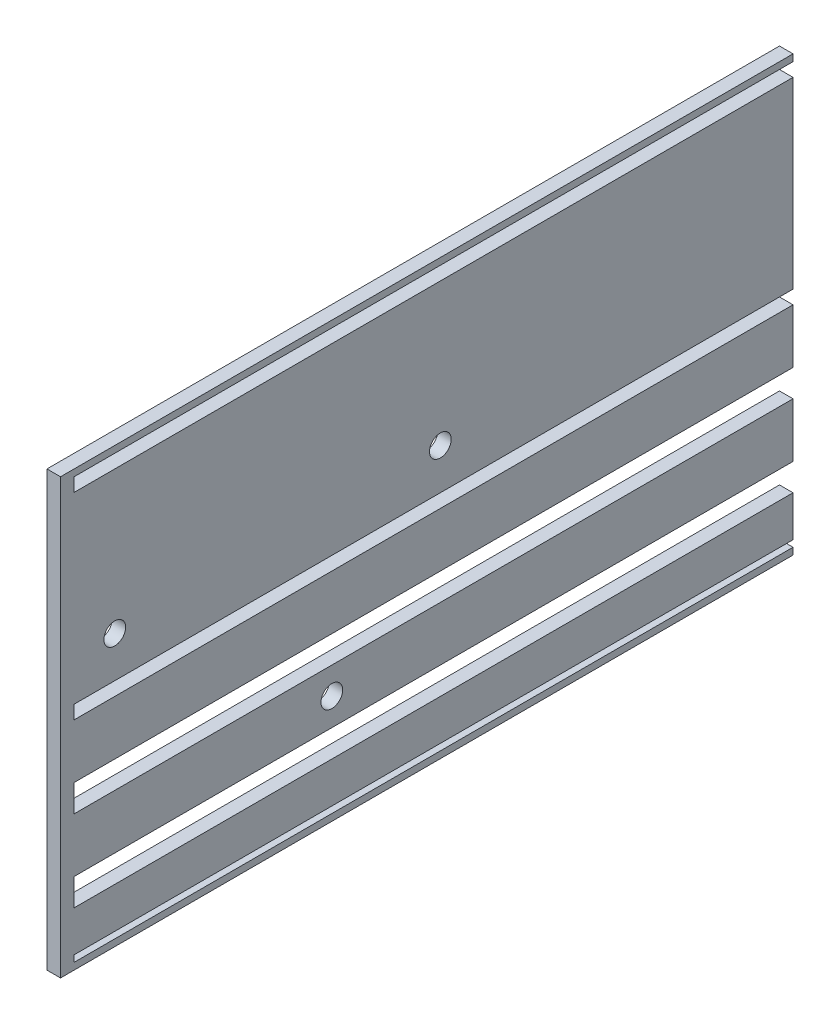
ISO-10303-21;
HEADER;
FILE_DESCRIPTION(('STEP AP214'),'2;1');
FILE_NAME('part.step','',(''),(''),'','','');
FILE_SCHEMA(('AUTOMOTIVE_DESIGN { 1 0 10303 214 1 1 1 1 }'));
ENDSEC;
DATA;
#1=APPLICATION_CONTEXT('core data for automotive mechanical design processes');
#2=APPLICATION_PROTOCOL_DEFINITION('international standard','automotive_design',2000,#1);
#3=PRODUCT_CONTEXT('',#1,'mechanical');
#4=PRODUCT('Part','Part','',(#3));
#5=PRODUCT_RELATED_PRODUCT_CATEGORY('part','',(#4));
#6=PRODUCT_DEFINITION_FORMATION('','',#4);
#7=PRODUCT_DEFINITION_CONTEXT('part definition',#1,'design');
#8=PRODUCT_DEFINITION('design','',#6,#7);
#9=PRODUCT_DEFINITION_SHAPE('','',#8);
#10=(LENGTH_UNIT() NAMED_UNIT(*) SI_UNIT(.MILLI.,.METRE.));
#11=(NAMED_UNIT(*) PLANE_ANGLE_UNIT() SI_UNIT($,.RADIAN.));
#12=(NAMED_UNIT(*) SI_UNIT($,.STERADIAN.) SOLID_ANGLE_UNIT());
#13=UNCERTAINTY_MEASURE_WITH_UNIT(LENGTH_MEASURE(1.E-05),#10,'distance_accuracy_value','');
#14=(GEOMETRIC_REPRESENTATION_CONTEXT(3) GLOBAL_UNCERTAINTY_ASSIGNED_CONTEXT((#13)) GLOBAL_UNIT_ASSIGNED_CONTEXT((#10,
#11,#12)) REPRESENTATION_CONTEXT('',''));
#15=CARTESIAN_POINT('',(0.,0.,0.));
#16=DIRECTION('',(0.,0.,1.));
#17=DIRECTION('',(1.,0.,0.));
#18=AXIS2_PLACEMENT_3D('',#15,#16,#17);
#19=CARTESIAN_POINT('',(3.175,-5.81125642686648,-53.1083643126292));
#20=DIRECTION('',(0.,0.,-1.));
#21=DIRECTION('',(0.,1.,0.));
#22=AXIS2_PLACEMENT_3D('',#19,#20,#21);
#23=PLANE('',#22);
#24=DIRECTION('',(0.,-1.,0.));
#25=VECTOR('',#24,1.);
#26=CARTESIAN_POINT('',(0.,-5.81125642686648,-53.1083643126292));
#27=LINE('',#26,#25);
#28=CARTESIAN_POINT('',(0.,-43.9798364268665,-53.1083643126292));
#29=VERTEX_POINT('',#28);
#30=CARTESIAN_POINT('',(0.,-53.5048364268665,-53.1083643126292));
#31=VERTEX_POINT('',#30);
#32=EDGE_CURVE('E234',#29,#31,#27,.T.);
#33=ORIENTED_EDGE('',*,*,#32,.F.);
#34=DIRECTION('',(-1.,0.,0.));
#35=VECTOR('',#34,1.);
#36=CARTESIAN_POINT('',(3.175,-43.9798364268665,-53.1083643126292));
#37=LINE('',#36,#35);
#38=CARTESIAN_POINT('',(3.175,-43.9798364268665,-53.1083643126292));
#39=VERTEX_POINT('',#38);
#40=EDGE_CURVE('E11',#39,#29,#37,.T.);
#41=ORIENTED_EDGE('',*,*,#40,.F.);
#42=DIRECTION('',(0.,-1.,0.));
#43=VECTOR('',#42,1.);
#44=CARTESIAN_POINT('',(3.175,-5.81125642686648,-53.1083643126292));
#45=LINE('',#44,#43);
#46=CARTESIAN_POINT('',(3.175,-53.5048364268665,-53.1083643126292));
#47=VERTEX_POINT('',#46);
#48=EDGE_CURVE('E300',#39,#47,#45,.T.);
#49=ORIENTED_EDGE('',*,*,#48,.T.);
#50=DIRECTION('',(-1.,0.,0.));
#51=VECTOR('',#50,1.);
#52=CARTESIAN_POINT('',(3.175,-53.5048364268665,-53.1083643126292));
#53=LINE('',#52,#51);
#54=EDGE_CURVE('E134',#47,#31,#53,.T.);
#55=ORIENTED_EDGE('',*,*,#54,.T.);
#56=EDGE_LOOP('',(#33,#41,#49,#55));
#57=FACE_BOUND('',#56,.T.);
#58=ADVANCED_FACE('F35',(#57),#23,.T.);
#59=CARTESIAN_POINT('',(3.175,-43.9798364268665,-138.212489394148));
#60=DIRECTION('',(0.,1.,0.));
#61=DIRECTION('',(0.,0.,1.));
#62=AXIS2_PLACEMENT_3D('',#59,#60,#61);
#63=PLANE('',#62);
#64=DIRECTION('',(0.,0.,-1.));
#65=VECTOR('',#64,1.);
#66=CARTESIAN_POINT('',(0.,-43.9798364268665,-138.212489394148));
#67=LINE('',#66,#65);
#68=CARTESIAN_POINT('',(0.,-43.9798364268665,115.166635687371));
#69=VERTEX_POINT('',#68);
#70=EDGE_CURVE('E237',#69,#29,#67,.T.);
#71=ORIENTED_EDGE('',*,*,#70,.F.);
#72=DIRECTION('',(-1.,0.,0.));
#73=VECTOR('',#72,1.);
#74=CARTESIAN_POINT('',(3.175,-43.9798364268665,115.166635687371));
#75=LINE('',#74,#73);
#76=CARTESIAN_POINT('',(3.175,-43.9798364268665,115.166635687371));
#77=VERTEX_POINT('',#76);
#78=EDGE_CURVE('E44',#77,#69,#75,.T.);
#79=ORIENTED_EDGE('',*,*,#78,.F.);
#80=DIRECTION('',(0.,0.,-1.));
#81=VECTOR('',#80,1.);
#82=CARTESIAN_POINT('',(3.175,-43.9798364268665,-138.212489394148));
#83=LINE('',#82,#81);
#84=EDGE_CURVE('E365',#77,#39,#83,.T.);
#85=ORIENTED_EDGE('',*,*,#84,.T.);
#86=ORIENTED_EDGE('',*,*,#40,.T.);
#87=EDGE_LOOP('',(#71,#79,#85,#86));
#88=FACE_BOUND('',#87,.T.);
#89=ADVANCED_FACE('F37',(#88),#63,.T.);
#90=CARTESIAN_POINT('',(3.175,-5.81125642686647,115.166635687371));
#91=DIRECTION('',(0.,0.,-1.));
#92=DIRECTION('',(-1.,0.,0.));
#93=AXIS2_PLACEMENT_3D('',#90,#91,#92);
#94=PLANE('',#93);
#95=DIRECTION('',(0.,-1.,0.));
#96=VECTOR('',#95,1.);
#97=CARTESIAN_POINT('',(0.,-5.81125642686647,115.166635687371));
#98=LINE('',#97,#96);
#99=CARTESIAN_POINT('',(0.,-37.6298364268665,115.166635687371));
#100=VERTEX_POINT('',#99);
#101=EDGE_CURVE('E242',#100,#69,#98,.T.);
#102=ORIENTED_EDGE('',*,*,#101,.F.);
#103=DIRECTION('',(-1.,0.,0.));
#104=VECTOR('',#103,1.);
#105=CARTESIAN_POINT('',(3.175,-37.6298364268665,115.166635687371));
#106=LINE('',#105,#104);
#107=CARTESIAN_POINT('',(3.175,-37.6298364268665,115.166635687371));
#108=VERTEX_POINT('',#107);
#109=EDGE_CURVE('E339',#108,#100,#106,.T.);
#110=ORIENTED_EDGE('',*,*,#109,.F.);
#111=DIRECTION('',(0.,-1.,0.));
#112=VECTOR('',#111,1.);
#113=CARTESIAN_POINT('',(3.175,-5.81125642686647,115.166635687371));
#114=LINE('',#113,#112);
#115=EDGE_CURVE('E346',#108,#77,#114,.T.);
#116=ORIENTED_EDGE('',*,*,#115,.T.);
#117=ORIENTED_EDGE('',*,*,#78,.T.);
#118=EDGE_LOOP('',(#102,#110,#116,#117));
#119=FACE_BOUND('',#118,.T.);
#120=ADVANCED_FACE('F344',(#119),#94,.T.);
#121=CARTESIAN_POINT('',(3.175,-37.6298364268665,-138.212489394148));
#122=DIRECTION('',(0.,1.,0.));
#123=DIRECTION('',(0.,0.,1.));
#124=AXIS2_PLACEMENT_3D('',#121,#122,#123);
#125=PLANE('',#124);
#126=DIRECTION('',(0.,0.,-1.));
#127=VECTOR('',#126,1.);
#128=CARTESIAN_POINT('',(0.,-37.6298364268665,-138.212489394148));
#129=LINE('',#128,#127);
#130=CARTESIAN_POINT('',(0.,-37.6298364268665,-53.1083643126292));
#131=VERTEX_POINT('',#130);
#132=EDGE_CURVE('E245',#100,#131,#129,.T.);
#133=ORIENTED_EDGE('',*,*,#132,.T.);
#134=DIRECTION('',(-1.,0.,0.));
#135=VECTOR('',#134,1.);
#136=CARTESIAN_POINT('',(3.175,-37.6298364268665,-53.1083643126292));
#137=LINE('',#136,#135);
#138=CARTESIAN_POINT('',(3.175,-37.6298364268665,-53.1083643126292));
#139=VERTEX_POINT('',#138);
#140=EDGE_CURVE('E337',#139,#131,#137,.T.);
#141=ORIENTED_EDGE('',*,*,#140,.F.);
#142=DIRECTION('',(0.,0.,-1.));
#143=VECTOR('',#142,1.);
#144=CARTESIAN_POINT('',(3.175,-37.6298364268665,-138.212489394148));
#145=LINE('',#144,#143);
#146=EDGE_CURVE('E361',#108,#139,#145,.T.);
#147=ORIENTED_EDGE('',*,*,#146,.F.);
#148=ORIENTED_EDGE('',*,*,#109,.T.);
#149=EDGE_LOOP('',(#133,#141,#147,#148));
#150=FACE_BOUND('',#149,.T.);
#151=ADVANCED_FACE('F358',(#150),#125,.F.);
#152=CARTESIAN_POINT('',(0.,-24.9298364268665,-53.1083643126292));
#153=VERTEX_POINT('',#152);
#154=EDGE_CURVE('E239',#153,#131,#27,.T.);
#155=ORIENTED_EDGE('',*,*,#154,.F.);
#156=DIRECTION('',(-1.,0.,0.));
#157=VECTOR('',#156,1.);
#158=CARTESIAN_POINT('',(3.175,-24.9298364268665,-53.1083643126292));
#159=LINE('',#158,#157);
#160=CARTESIAN_POINT('',(3.175,-24.9298364268665,-53.1083643126292));
#161=VERTEX_POINT('',#160);
#162=EDGE_CURVE('E335',#161,#153,#159,.T.);
#163=ORIENTED_EDGE('',*,*,#162,.F.);
#164=EDGE_CURVE('E363',#161,#139,#45,.T.);
#165=ORIENTED_EDGE('',*,*,#164,.T.);
#166=ORIENTED_EDGE('',*,*,#140,.T.);
#167=EDGE_LOOP('',(#155,#163,#165,#166));
#168=FACE_BOUND('',#167,.T.);
#169=ADVANCED_FACE('F468',(#168),#23,.T.);
#170=CARTESIAN_POINT('',(3.175,-24.9298364268665,-138.212489394148));
#171=DIRECTION('',(0.,1.,0.));
#172=DIRECTION('',(0.,0.,1.));
#173=AXIS2_PLACEMENT_3D('',#170,#171,#172);
#174=PLANE('',#173);
#175=DIRECTION('',(0.,0.,-1.));
#176=VECTOR('',#175,1.);
#177=CARTESIAN_POINT('',(0.,-24.9298364268665,-138.212489394148));
#178=LINE('',#177,#176);
#179=CARTESIAN_POINT('',(0.,-24.9298364268665,115.166635687371));
#180=VERTEX_POINT('',#179);
#181=EDGE_CURVE('E248',#180,#153,#178,.T.);
#182=ORIENTED_EDGE('',*,*,#181,.F.);
#183=DIRECTION('',(-1.,0.,0.));
#184=VECTOR('',#183,1.);
#185=CARTESIAN_POINT('',(3.175,-24.9298364268665,115.166635687371));
#186=LINE('',#185,#184);
#187=CARTESIAN_POINT('',(3.175,-24.9298364268665,115.166635687371));
#188=VERTEX_POINT('',#187);
#189=EDGE_CURVE('E333',#188,#180,#186,.T.);
#190=ORIENTED_EDGE('',*,*,#189,.F.);
#191=DIRECTION('',(0.,0.,-1.));
#192=VECTOR('',#191,1.);
#193=CARTESIAN_POINT('',(3.175,-24.9298364268665,-138.212489394148));
#194=LINE('',#193,#192);
#195=EDGE_CURVE('E370',#188,#161,#194,.T.);
#196=ORIENTED_EDGE('',*,*,#195,.T.);
#197=ORIENTED_EDGE('',*,*,#162,.T.);
#198=EDGE_LOOP('',(#182,#190,#196,#197));
#199=FACE_BOUND('',#198,.T.);
#200=ADVANCED_FACE('F475',(#199),#174,.T.);
#201=CARTESIAN_POINT('',(3.175,-5.81125642686647,115.166635687371));
#202=DIRECTION('',(0.,0.,-1.));
#203=DIRECTION('',(-1.,0.,0.));
#204=AXIS2_PLACEMENT_3D('',#201,#202,#203);
#205=PLANE('',#204);
#206=DIRECTION('',(0.,-1.,0.));
#207=VECTOR('',#206,1.);
#208=CARTESIAN_POINT('',(0.,-5.81125642686647,115.166635687371));
#209=LINE('',#208,#207);
#210=CARTESIAN_POINT('',(0.,-18.5798364268665,115.166635687371));
#211=VERTEX_POINT('',#210);
#212=EDGE_CURVE('E251',#211,#180,#209,.T.);
#213=ORIENTED_EDGE('',*,*,#212,.F.);
#214=DIRECTION('',(-1.,0.,0.));
#215=VECTOR('',#214,1.);
#216=CARTESIAN_POINT('',(3.175,-18.5798364268665,115.166635687371));
#217=LINE('',#216,#215);
#218=CARTESIAN_POINT('',(3.175,-18.5798364268665,115.166635687371));
#219=VERTEX_POINT('',#218);
#220=EDGE_CURVE('E331',#219,#211,#217,.T.);
#221=ORIENTED_EDGE('',*,*,#220,.F.);
#222=DIRECTION('',(0.,-1.,0.));
#223=VECTOR('',#222,1.);
#224=CARTESIAN_POINT('',(3.175,-5.81125642686647,115.166635687371));
#225=LINE('',#224,#223);
#226=EDGE_CURVE('E373',#219,#188,#225,.T.);
#227=ORIENTED_EDGE('',*,*,#226,.T.);
#228=ORIENTED_EDGE('',*,*,#189,.T.);
#229=EDGE_LOOP('',(#213,#221,#227,#228));
#230=FACE_BOUND('',#229,.T.);
#231=ADVANCED_FACE('F508',(#230),#205,.T.);
#232=CARTESIAN_POINT('',(3.175,-18.5798364268665,-138.212489394148));
#233=DIRECTION('',(0.,1.,0.));
#234=DIRECTION('',(0.,0.,1.));
#235=AXIS2_PLACEMENT_3D('',#232,#233,#234);
#236=PLANE('',#235);
#237=DIRECTION('',(0.,0.,-1.));
#238=VECTOR('',#237,1.);
#239=CARTESIAN_POINT('',(0.,-18.5798364268665,-138.212489394148));
#240=LINE('',#239,#238);
#241=CARTESIAN_POINT('',(0.,-18.5798364268665,-53.1083643126292));
#242=VERTEX_POINT('',#241);
#243=EDGE_CURVE('E254',#211,#242,#240,.T.);
#244=ORIENTED_EDGE('',*,*,#243,.T.);
#245=DIRECTION('',(-1.,0.,0.));
#246=VECTOR('',#245,1.);
#247=CARTESIAN_POINT('',(3.175,-18.5798364268665,-53.1083643126292));
#248=LINE('',#247,#246);
#249=CARTESIAN_POINT('',(3.175,-18.5798364268665,-53.1083643126292));
#250=VERTEX_POINT('',#249);
#251=EDGE_CURVE('E329',#250,#242,#248,.T.);
#252=ORIENTED_EDGE('',*,*,#251,.F.);
#253=DIRECTION('',(0.,0.,-1.));
#254=VECTOR('',#253,1.);
#255=CARTESIAN_POINT('',(3.175,-18.5798364268665,-138.212489394148));
#256=LINE('',#255,#254);
#257=EDGE_CURVE('E376',#219,#250,#256,.T.);
#258=ORIENTED_EDGE('',*,*,#257,.F.);
#259=ORIENTED_EDGE('',*,*,#220,.T.);
#260=EDGE_LOOP('',(#244,#252,#258,#259));
#261=FACE_BOUND('',#260,.T.);
#262=ADVANCED_FACE('F501',(#261),#236,.F.);
#263=CARTESIAN_POINT('',(0.,-5.87983642686649,-53.1083643126292));
#264=VERTEX_POINT('',#263);
#265=EDGE_CURVE('E257',#264,#242,#27,.T.);
#266=ORIENTED_EDGE('',*,*,#265,.F.);
#267=DIRECTION('',(-1.,0.,0.));
#268=VECTOR('',#267,1.);
#269=CARTESIAN_POINT('',(3.175,-5.87983642686649,-53.1083643126292));
#270=LINE('',#269,#268);
#271=CARTESIAN_POINT('',(3.175,-5.87983642686649,-53.1083643126292));
#272=VERTEX_POINT('',#271);
#273=EDGE_CURVE('E327',#272,#264,#270,.T.);
#274=ORIENTED_EDGE('',*,*,#273,.F.);
#275=EDGE_CURVE('E378',#272,#250,#45,.T.);
#276=ORIENTED_EDGE('',*,*,#275,.T.);
#277=ORIENTED_EDGE('',*,*,#251,.T.);
#278=EDGE_LOOP('',(#266,#274,#276,#277));
#279=FACE_BOUND('',#278,.T.);
#280=ADVANCED_FACE('F476',(#279),#23,.T.);
#281=CARTESIAN_POINT('',(3.175,-5.87983642686649,-138.212489394148));
#282=DIRECTION('',(0.,1.,0.));
#283=DIRECTION('',(0.,0.,1.));
#284=AXIS2_PLACEMENT_3D('',#281,#282,#283);
#285=PLANE('',#284);
#286=DIRECTION('',(0.,0.,-1.));
#287=VECTOR('',#286,1.);
#288=CARTESIAN_POINT('',(0.,-5.87983642686649,-138.212489394148));
#289=LINE('',#288,#287);
#290=CARTESIAN_POINT('',(0.,-5.87983642686649,115.166635687371));
#291=VERTEX_POINT('',#290);
#292=EDGE_CURVE('E258',#291,#264,#289,.T.);
#293=ORIENTED_EDGE('',*,*,#292,.F.);
#294=DIRECTION('',(-1.,0.,0.));
#295=VECTOR('',#294,1.);
#296=CARTESIAN_POINT('',(3.175,-5.87983642686649,115.166635687371));
#297=LINE('',#296,#295);
#298=CARTESIAN_POINT('',(3.175,-5.87983642686649,115.166635687371));
#299=VERTEX_POINT('',#298);
#300=EDGE_CURVE('E325',#299,#291,#297,.T.);
#301=ORIENTED_EDGE('',*,*,#300,.F.);
#302=DIRECTION('',(0.,0.,-1.));
#303=VECTOR('',#302,1.);
#304=CARTESIAN_POINT('',(3.175,-5.87983642686649,-138.212489394148));
#305=LINE('',#304,#303);
#306=EDGE_CURVE('E379',#299,#272,#305,.T.);
#307=ORIENTED_EDGE('',*,*,#306,.T.);
#308=ORIENTED_EDGE('',*,*,#273,.T.);
#309=EDGE_LOOP('',(#293,#301,#307,#308));
#310=FACE_BOUND('',#309,.T.);
#311=ADVANCED_FACE('F500',(#310),#285,.T.);
#312=CARTESIAN_POINT('',(3.175,-5.81125642686647,115.166635687371));
#313=DIRECTION('',(0.,0.,-1.));
#314=DIRECTION('',(-1.,0.,0.));
#315=AXIS2_PLACEMENT_3D('',#312,#313,#314);
#316=PLANE('',#315);
#317=DIRECTION('',(0.,-1.,0.));
#318=VECTOR('',#317,1.);
#319=CARTESIAN_POINT('',(0.,-5.81125642686647,115.166635687371));
#320=LINE('',#319,#318);
#321=CARTESIAN_POINT('',(0.,-2.70483642686649,115.166635687371));
#322=VERTEX_POINT('',#321);
#323=EDGE_CURVE('E261',#322,#291,#320,.T.);
#324=ORIENTED_EDGE('',*,*,#323,.F.);
#325=DIRECTION('',(-1.,0.,0.));
#326=VECTOR('',#325,1.);
#327=CARTESIAN_POINT('',(3.175,-2.70483642686649,115.166635687371));
#328=LINE('',#327,#326);
#329=CARTESIAN_POINT('',(3.175,-2.70483642686649,115.166635687371));
#330=VERTEX_POINT('',#329);
#331=EDGE_CURVE('E323',#330,#322,#328,.T.);
#332=ORIENTED_EDGE('',*,*,#331,.F.);
#333=DIRECTION('',(0.,-1.,0.));
#334=VECTOR('',#333,1.);
#335=CARTESIAN_POINT('',(3.175,-5.81125642686647,115.166635687371));
#336=LINE('',#335,#334);
#337=EDGE_CURVE('E382',#330,#299,#336,.T.);
#338=ORIENTED_EDGE('',*,*,#337,.T.);
#339=ORIENTED_EDGE('',*,*,#300,.T.);
#340=EDGE_LOOP('',(#324,#332,#338,#339));
#341=FACE_BOUND('',#340,.T.);
#342=ADVANCED_FACE('F496',(#341),#316,.T.);
#343=CARTESIAN_POINT('',(3.175,-2.70483642686649,-138.212489394148));
#344=DIRECTION('',(0.,1.,0.));
#345=DIRECTION('',(0.,0.,1.));
#346=AXIS2_PLACEMENT_3D('',#343,#344,#345);
#347=PLANE('',#346);
#348=DIRECTION('',(0.,0.,-1.));
#349=VECTOR('',#348,1.);
#350=CARTESIAN_POINT('',(0.,-2.70483642686649,-138.212489394148));
#351=LINE('',#350,#349);
#352=CARTESIAN_POINT('',(0.,-2.70483642686649,-53.1083643126292));
#353=VERTEX_POINT('',#352);
#354=EDGE_CURVE('E264',#322,#353,#351,.T.);
#355=ORIENTED_EDGE('',*,*,#354,.T.);
#356=DIRECTION('',(-1.,0.,0.));
#357=VECTOR('',#356,1.);
#358=CARTESIAN_POINT('',(3.175,-2.70483642686649,-53.1083643126292));
#359=LINE('',#358,#357);
#360=CARTESIAN_POINT('',(3.175,-2.70483642686649,-53.1083643126292));
#361=VERTEX_POINT('',#360);
#362=EDGE_CURVE('E321',#361,#353,#359,.T.);
#363=ORIENTED_EDGE('',*,*,#362,.F.);
#364=DIRECTION('',(0.,0.,-1.));
#365=VECTOR('',#364,1.);
#366=CARTESIAN_POINT('',(3.175,-2.70483642686649,-138.212489394148));
#367=LINE('',#366,#365);
#368=EDGE_CURVE('E385',#330,#361,#367,.T.);
#369=ORIENTED_EDGE('',*,*,#368,.F.);
#370=ORIENTED_EDGE('',*,*,#331,.T.);
#371=EDGE_LOOP('',(#355,#363,#369,#370));
#372=FACE_BOUND('',#371,.T.);
#373=ADVANCED_FACE('F490',(#372),#347,.F.);
#374=CARTESIAN_POINT('',(0.,40.2262435731335,-53.1083643126292));
#375=VERTEX_POINT('',#374);
#376=EDGE_CURVE('E267',#375,#353,#27,.T.);
#377=ORIENTED_EDGE('',*,*,#376,.F.);
#378=DIRECTION('',(-1.,0.,0.));
#379=VECTOR('',#378,1.);
#380=CARTESIAN_POINT('',(3.175,40.2262435731335,-53.1083643126292));
#381=LINE('',#380,#379);
#382=CARTESIAN_POINT('',(3.175,40.2262435731335,-53.1083643126292));
#383=VERTEX_POINT('',#382);
#384=EDGE_CURVE('E319',#383,#375,#381,.T.);
#385=ORIENTED_EDGE('',*,*,#384,.F.);
#386=EDGE_CURVE('E387',#383,#361,#45,.T.);
#387=ORIENTED_EDGE('',*,*,#386,.T.);
#388=ORIENTED_EDGE('',*,*,#362,.T.);
#389=EDGE_LOOP('',(#377,#385,#387,#388));
#390=FACE_BOUND('',#389,.T.);
#391=ADVANCED_FACE('F414',(#390),#23,.T.);
#392=CARTESIAN_POINT('',(3.175,40.2262435731335,-138.212489394148));
#393=DIRECTION('',(0.,1.,0.));
#394=DIRECTION('',(0.,0.,1.));
#395=AXIS2_PLACEMENT_3D('',#392,#393,#394);
#396=PLANE('',#395);
#397=DIRECTION('',(0.,0.,-1.));
#398=VECTOR('',#397,1.);
#399=CARTESIAN_POINT('',(0.,40.2262435731335,-138.212489394148));
#400=LINE('',#399,#398);
#401=CARTESIAN_POINT('',(0.,40.2262435731335,115.166635687371));
#402=VERTEX_POINT('',#401);
#403=EDGE_CURVE('E268',#402,#375,#400,.T.);
#404=ORIENTED_EDGE('',*,*,#403,.F.);
#405=DIRECTION('',(-1.,0.,0.));
#406=VECTOR('',#405,1.);
#407=CARTESIAN_POINT('',(3.175,40.2262435731335,115.166635687371));
#408=LINE('',#407,#406);
#409=CARTESIAN_POINT('',(3.175,40.2262435731335,115.166635687371));
#410=VERTEX_POINT('',#409);
#411=EDGE_CURVE('E317',#410,#402,#408,.T.);
#412=ORIENTED_EDGE('',*,*,#411,.F.);
#413=DIRECTION('',(0.,0.,-1.));
#414=VECTOR('',#413,1.);
#415=CARTESIAN_POINT('',(3.175,40.2262435731335,-138.212489394148));
#416=LINE('',#415,#414);
#417=EDGE_CURVE('E388',#410,#383,#416,.T.);
#418=ORIENTED_EDGE('',*,*,#417,.T.);
#419=ORIENTED_EDGE('',*,*,#384,.T.);
#420=EDGE_LOOP('',(#404,#412,#418,#419));
#421=FACE_BOUND('',#420,.T.);
#422=ADVANCED_FACE('F422',(#421),#396,.T.);
#423=CARTESIAN_POINT('',(3.175,-5.81125642686647,115.166635687371));
#424=DIRECTION('',(0.,0.,-1.));
#425=DIRECTION('',(-1.,0.,0.));
#426=AXIS2_PLACEMENT_3D('',#423,#424,#425);
#427=PLANE('',#426);
#428=DIRECTION('',(0.,-1.,0.));
#429=VECTOR('',#428,1.);
#430=CARTESIAN_POINT('',(0.,-5.81125642686647,115.166635687371));
#431=LINE('',#430,#429);
#432=CARTESIAN_POINT('',(0.,43.4012435731335,115.166635687371));
#433=VERTEX_POINT('',#432);
#434=EDGE_CURVE('E271',#433,#402,#431,.T.);
#435=ORIENTED_EDGE('',*,*,#434,.F.);
#436=DIRECTION('',(-1.,0.,0.));
#437=VECTOR('',#436,1.);
#438=CARTESIAN_POINT('',(3.175,43.4012435731335,115.166635687371));
#439=LINE('',#438,#437);
#440=CARTESIAN_POINT('',(3.175,43.4012435731335,115.166635687371));
#441=VERTEX_POINT('',#440);
#442=EDGE_CURVE('E315',#441,#433,#439,.T.);
#443=ORIENTED_EDGE('',*,*,#442,.F.);
#444=DIRECTION('',(0.,-1.,0.));
#445=VECTOR('',#444,1.);
#446=CARTESIAN_POINT('',(3.175,-5.81125642686647,115.166635687371));
#447=LINE('',#446,#445);
#448=EDGE_CURVE('E391',#441,#410,#447,.T.);
#449=ORIENTED_EDGE('',*,*,#448,.T.);
#450=ORIENTED_EDGE('',*,*,#411,.T.);
#451=EDGE_LOOP('',(#435,#443,#449,#450));
#452=FACE_BOUND('',#451,.T.);
#453=ADVANCED_FACE('F425',(#452),#427,.T.);
#454=CARTESIAN_POINT('',(3.175,43.4012435731335,-138.212489394148));
#455=DIRECTION('',(0.,1.,0.));
#456=DIRECTION('',(0.,0.,1.));
#457=AXIS2_PLACEMENT_3D('',#454,#455,#456);
#458=PLANE('',#457);
#459=DIRECTION('',(0.,0.,-1.));
#460=VECTOR('',#459,1.);
#461=CARTESIAN_POINT('',(0.,43.4012435731335,-138.212489394148));
#462=LINE('',#461,#460);
#463=CARTESIAN_POINT('',(0.,43.4012435731335,-53.1083643126292));
#464=VERTEX_POINT('',#463);
#465=EDGE_CURVE('E274',#433,#464,#462,.T.);
#466=ORIENTED_EDGE('',*,*,#465,.T.);
#467=DIRECTION('',(-1.,0.,0.));
#468=VECTOR('',#467,1.);
#469=CARTESIAN_POINT('',(3.175,43.4012435731335,-53.1083643126292));
#470=LINE('',#469,#468);
#471=CARTESIAN_POINT('',(3.175,43.4012435731335,-53.1083643126292));
#472=VERTEX_POINT('',#471);
#473=EDGE_CURVE('E313',#472,#464,#470,.T.);
#474=ORIENTED_EDGE('',*,*,#473,.F.);
#475=DIRECTION('',(0.,0.,-1.));
#476=VECTOR('',#475,1.);
#477=CARTESIAN_POINT('',(3.175,43.4012435731335,-138.212489394148));
#478=LINE('',#477,#476);
#479=EDGE_CURVE('E394',#441,#472,#478,.T.);
#480=ORIENTED_EDGE('',*,*,#479,.F.);
#481=ORIENTED_EDGE('',*,*,#442,.T.);
#482=EDGE_LOOP('',(#466,#474,#480,#481));
#483=FACE_BOUND('',#482,.T.);
#484=ADVANCED_FACE('F431',(#483),#458,.F.);
#485=CARTESIAN_POINT('',(0.,44.9887435731335,-53.1083643126292));
#486=VERTEX_POINT('',#485);
#487=EDGE_CURVE('E277',#486,#464,#27,.T.);
#488=ORIENTED_EDGE('',*,*,#487,.F.);
#489=DIRECTION('',(-1.,0.,0.));
#490=VECTOR('',#489,1.);
#491=CARTESIAN_POINT('',(3.175,44.9887435731335,-53.1083643126292));
#492=LINE('',#491,#490);
#493=CARTESIAN_POINT('',(3.175,44.9887435731335,-53.1083643126292));
#494=VERTEX_POINT('',#493);
#495=EDGE_CURVE('E311',#494,#486,#492,.T.);
#496=ORIENTED_EDGE('',*,*,#495,.F.);
#497=EDGE_CURVE('E396',#494,#472,#45,.T.);
#498=ORIENTED_EDGE('',*,*,#497,.T.);
#499=ORIENTED_EDGE('',*,*,#473,.T.);
#500=EDGE_LOOP('',(#488,#496,#498,#499));
#501=FACE_BOUND('',#500,.T.);
#502=ADVANCED_FACE('F436',(#501),#23,.T.);
#503=CARTESIAN_POINT('',(3.175,44.9887435731335,-138.212489394148));
#504=DIRECTION('',(0.,1.,0.));
#505=DIRECTION('',(0.,0.,1.));
#506=AXIS2_PLACEMENT_3D('',#503,#504,#505);
#507=PLANE('',#506);
#508=DIRECTION('',(0.,0.,-1.));
#509=VECTOR('',#508,1.);
#510=CARTESIAN_POINT('',(0.,44.9887435731335,-138.212489394148));
#511=LINE('',#510,#509);
#512=CARTESIAN_POINT('',(0.,44.9887435731335,118.341635687371));
#513=VERTEX_POINT('',#512);
#514=EDGE_CURVE('E278',#513,#486,#511,.T.);
#515=ORIENTED_EDGE('',*,*,#514,.F.);
#516=DIRECTION('',(-1.,0.,0.));
#517=VECTOR('',#516,1.);
#518=CARTESIAN_POINT('',(3.175,44.9887435731335,118.341635687371));
#519=LINE('',#518,#517);
#520=CARTESIAN_POINT('',(3.175,44.9887435731335,118.341635687371));
#521=VERTEX_POINT('',#520);
#522=EDGE_CURVE('E309',#521,#513,#519,.T.);
#523=ORIENTED_EDGE('',*,*,#522,.F.);
#524=DIRECTION('',(0.,0.,-1.));
#525=VECTOR('',#524,1.);
#526=CARTESIAN_POINT('',(3.175,44.9887435731335,-138.212489394148));
#527=LINE('',#526,#525);
#528=EDGE_CURVE('E397',#521,#494,#527,.T.);
#529=ORIENTED_EDGE('',*,*,#528,.T.);
#530=ORIENTED_EDGE('',*,*,#495,.T.);
#531=EDGE_LOOP('',(#515,#523,#529,#530));
#532=FACE_BOUND('',#531,.T.);
#533=ADVANCED_FACE('F439',(#532),#507,.T.);
#534=CARTESIAN_POINT('',(3.175,-5.81125642686651,118.341635687371));
#535=DIRECTION('',(0.,0.,-1.));
#536=DIRECTION('',(0.,1.,0.));
#537=AXIS2_PLACEMENT_3D('',#534,#535,#536);
#538=PLANE('',#537);
#539=DIRECTION('',(0.,-1.,0.));
#540=VECTOR('',#539,1.);
#541=CARTESIAN_POINT('',(0.,-5.81125642686651,118.341635687371));
#542=LINE('',#541,#540);
#543=CARTESIAN_POINT('',(0.,-56.6112564268665,118.341635687371));
#544=VERTEX_POINT('',#543);
#545=EDGE_CURVE('E281',#513,#544,#542,.T.);
#546=ORIENTED_EDGE('',*,*,#545,.T.);
#547=DIRECTION('',(-1.,0.,0.));
#548=VECTOR('',#547,1.);
#549=CARTESIAN_POINT('',(3.175,-56.6112564268665,118.341635687371));
#550=LINE('',#549,#548);
#551=CARTESIAN_POINT('',(3.175,-56.6112564268665,118.341635687371));
#552=VERTEX_POINT('',#551);
#553=EDGE_CURVE('E306',#552,#544,#550,.T.);
#554=ORIENTED_EDGE('',*,*,#553,.F.);
#555=DIRECTION('',(0.,-1.,0.));
#556=VECTOR('',#555,1.);
#557=CARTESIAN_POINT('',(3.175,-5.81125642686651,118.341635687371));
#558=LINE('',#557,#556);
#559=EDGE_CURVE('E400',#521,#552,#558,.T.);
#560=ORIENTED_EDGE('',*,*,#559,.F.);
#561=ORIENTED_EDGE('',*,*,#522,.T.);
#562=EDGE_LOOP('',(#546,#554,#560,#561));
#563=FACE_BOUND('',#562,.T.);
#564=ADVANCED_FACE('F443',(#563),#538,.F.);
#565=CARTESIAN_POINT('',(3.175,-56.6112564268665,-138.212489394148));
#566=DIRECTION('',(0.,1.,0.));
#567=DIRECTION('',(0.,0.,1.));
#568=AXIS2_PLACEMENT_3D('',#565,#566,#567);
#569=PLANE('',#568);
#570=DIRECTION('',(0.,0.,-1.));
#571=VECTOR('',#570,1.);
#572=CARTESIAN_POINT('',(0.,-56.6112564268665,-138.212489394148));
#573=LINE('',#572,#571);
#574=CARTESIAN_POINT('',(0.,-56.6112564268665,-53.1083643126292));
#575=VERTEX_POINT('',#574);
#576=EDGE_CURVE('E283',#544,#575,#573,.T.);
#577=ORIENTED_EDGE('',*,*,#576,.T.);
#578=DIRECTION('',(-1.,0.,0.));
#579=VECTOR('',#578,1.);
#580=CARTESIAN_POINT('',(3.175,-56.6112564268665,-53.1083643126292));
#581=LINE('',#580,#579);
#582=CARTESIAN_POINT('',(3.175,-56.6112564268665,-53.1083643126292));
#583=VERTEX_POINT('',#582);
#584=EDGE_CURVE('E304',#583,#575,#581,.T.);
#585=ORIENTED_EDGE('',*,*,#584,.F.);
#586=DIRECTION('',(0.,0.,-1.));
#587=VECTOR('',#586,1.);
#588=CARTESIAN_POINT('',(3.175,-56.6112564268665,-138.212489394148));
#589=LINE('',#588,#587);
#590=EDGE_CURVE('E401',#552,#583,#589,.T.);
#591=ORIENTED_EDGE('',*,*,#590,.F.);
#592=ORIENTED_EDGE('',*,*,#553,.T.);
#593=EDGE_LOOP('',(#577,#585,#591,#592));
#594=FACE_BOUND('',#593,.T.);
#595=ADVANCED_FACE('F447',(#594),#569,.F.);
#596=CARTESIAN_POINT('',(0.,-55.0237564268665,-53.1083643126292));
#597=VERTEX_POINT('',#596);
#598=EDGE_CURVE('E238',#597,#575,#27,.T.);
#599=ORIENTED_EDGE('',*,*,#598,.F.);
#600=DIRECTION('',(-1.,0.,0.));
#601=VECTOR('',#600,1.);
#602=CARTESIAN_POINT('',(3.175,-55.0237564268665,-53.1083643126292));
#603=LINE('',#602,#601);
#604=CARTESIAN_POINT('',(3.175,-55.0237564268665,-53.1083643126292));
#605=VERTEX_POINT('',#604);
#606=EDGE_CURVE('E211',#605,#597,#603,.T.);
#607=ORIENTED_EDGE('',*,*,#606,.F.);
#608=EDGE_CURVE('E218',#605,#583,#45,.T.);
#609=ORIENTED_EDGE('',*,*,#608,.T.);
#610=ORIENTED_EDGE('',*,*,#584,.T.);
#611=EDGE_LOOP('',(#599,#607,#609,#610));
#612=FACE_BOUND('',#611,.T.);
#613=ADVANCED_FACE('F450',(#612),#23,.T.);
#614=CARTESIAN_POINT('',(3.175,-55.0237564268665,-138.212489394148));
#615=DIRECTION('',(0.,1.,0.));
#616=DIRECTION('',(0.,0.,1.));
#617=AXIS2_PLACEMENT_3D('',#614,#615,#616);
#618=PLANE('',#617);
#619=DIRECTION('',(0.,0.,-1.));
#620=VECTOR('',#619,1.);
#621=CARTESIAN_POINT('',(0.,-55.0237564268665,-138.212489394148));
#622=LINE('',#621,#620);
#623=CARTESIAN_POINT('',(0.,-55.0237564268665,115.166635687371));
#624=VERTEX_POINT('',#623);
#625=EDGE_CURVE('E206',#624,#597,#622,.T.);
#626=ORIENTED_EDGE('',*,*,#625,.F.);
#627=DIRECTION('',(-1.,0.,0.));
#628=VECTOR('',#627,1.);
#629=CARTESIAN_POINT('',(3.175,-55.0237564268665,115.166635687371));
#630=LINE('',#629,#628);
#631=CARTESIAN_POINT('',(3.175,-55.0237564268665,115.166635687371));
#632=VERTEX_POINT('',#631);
#633=EDGE_CURVE('E201',#632,#624,#630,.T.);
#634=ORIENTED_EDGE('',*,*,#633,.F.);
#635=DIRECTION('',(0.,0.,-1.));
#636=VECTOR('',#635,1.);
#637=CARTESIAN_POINT('',(3.175,-55.0237564268665,-138.212489394148));
#638=LINE('',#637,#636);
#639=EDGE_CURVE('E204',#632,#605,#638,.T.);
#640=ORIENTED_EDGE('',*,*,#639,.T.);
#641=ORIENTED_EDGE('',*,*,#606,.T.);
#642=EDGE_LOOP('',(#626,#634,#640,#641));
#643=FACE_BOUND('',#642,.T.);
#644=ADVANCED_FACE('F203',(#643),#618,.T.);
#645=CARTESIAN_POINT('',(3.175,-5.81125642686647,115.166635687371));
#646=DIRECTION('',(0.,0.,-1.));
#647=DIRECTION('',(-1.,0.,0.));
#648=AXIS2_PLACEMENT_3D('',#645,#646,#647);
#649=PLANE('',#648);
#650=DIRECTION('',(0.,-1.,0.));
#651=VECTOR('',#650,1.);
#652=CARTESIAN_POINT('',(0.,-5.81125642686647,115.166635687371));
#653=LINE('',#652,#651);
#654=CARTESIAN_POINT('',(0.,-53.5048364268665,115.166635687371));
#655=VERTEX_POINT('',#654);
#656=EDGE_CURVE('E287',#655,#624,#653,.T.);
#657=ORIENTED_EDGE('',*,*,#656,.F.);
#658=DIRECTION('',(-1.,0.,0.));
#659=VECTOR('',#658,1.);
#660=CARTESIAN_POINT('',(3.175,-53.5048364268665,115.166635687371));
#661=LINE('',#660,#659);
#662=CARTESIAN_POINT('',(3.175,-53.5048364268665,115.166635687371));
#663=VERTEX_POINT('',#662);
#664=EDGE_CURVE('E127',#663,#655,#661,.T.);
#665=ORIENTED_EDGE('',*,*,#664,.F.);
#666=DIRECTION('',(0.,-1.,0.));
#667=VECTOR('',#666,1.);
#668=CARTESIAN_POINT('',(3.175,-5.81125642686647,115.166635687371));
#669=LINE('',#668,#667);
#670=EDGE_CURVE('E216',#663,#632,#669,.T.);
#671=ORIENTED_EDGE('',*,*,#670,.T.);
#672=ORIENTED_EDGE('',*,*,#633,.T.);
#673=EDGE_LOOP('',(#657,#665,#671,#672));
#674=FACE_BOUND('',#673,.T.);
#675=ADVANCED_FACE('F220',(#674),#649,.T.);
#676=CARTESIAN_POINT('',(3.175,6.88874357313351,29.4416356873708));
#677=DIRECTION('',(-1.,0.,0.));
#678=DIRECTION('',(0.,0.,1.));
#679=AXIS2_PLACEMENT_3D('',#676,#677,#678);
#680=CYLINDRICAL_SURFACE('',#679,2.54);
#681=CARTESIAN_POINT('',(3.175,6.88874357313351,29.4416356873708));
#682=DIRECTION('',(1.,0.,0.));
#683=DIRECTION('',(0.,0.,-1.));
#684=AXIS2_PLACEMENT_3D('',#681,#682,#683);
#685=CIRCLE('',#684,2.54);
#686=CARTESIAN_POINT('',(3.175,6.88874357313351,26.9016356873707));
#687=VERTEX_POINT('',#686);
#688=EDGE_CURVE('E228',#687,#687,#685,.T.);
#689=ORIENTED_EDGE('',*,*,#688,.T.);
#690=EDGE_LOOP('',(#689));
#691=FACE_BOUND('',#690,.T.);
#692=CARTESIAN_POINT('',(0.,6.88874357313351,29.4416356873708));
#693=DIRECTION('',(1.,0.,0.));
#694=DIRECTION('',(0.,0.,-1.));
#695=AXIS2_PLACEMENT_3D('',#692,#693,#694);
#696=CIRCLE('',#695,2.54);
#697=CARTESIAN_POINT('',(0.,6.88874357313351,26.9016356873707));
#698=VERTEX_POINT('',#697);
#699=EDGE_CURVE('E294',#698,#698,#696,.T.);
#700=ORIENTED_EDGE('',*,*,#699,.F.);
#701=EDGE_LOOP('',(#700));
#702=FACE_BOUND('',#701,.T.);
#703=ADVANCED_FACE('F462',(#691,#702),#680,.F.);
#704=CARTESIAN_POINT('',(3.175,-31.2112564268665,54.8416356873708));
#705=DIRECTION('',(-1.,0.,0.));
#706=DIRECTION('',(0.,0.,1.));
#707=AXIS2_PLACEMENT_3D('',#704,#705,#706);
#708=CYLINDRICAL_SURFACE('',#707,2.54);
#709=CARTESIAN_POINT('',(3.175,-31.2112564268665,54.8416356873708));
#710=DIRECTION('',(1.,0.,0.));
#711=DIRECTION('',(0.,0.,-1.));
#712=AXIS2_PLACEMENT_3D('',#709,#710,#711);
#713=CIRCLE('',#712,2.54);
#714=CARTESIAN_POINT('',(3.175,-31.2112564268665,52.3016356873708));
#715=VERTEX_POINT('',#714);
#716=EDGE_CURVE('E222',#715,#715,#713,.T.);
#717=ORIENTED_EDGE('',*,*,#716,.T.);
#718=EDGE_LOOP('',(#717));
#719=FACE_BOUND('',#718,.T.);
#720=CARTESIAN_POINT('',(0.,-31.2112564268665,54.8416356873708));
#721=DIRECTION('',(1.,0.,0.));
#722=DIRECTION('',(0.,0.,-1.));
#723=AXIS2_PLACEMENT_3D('',#720,#721,#722);
#724=CIRCLE('',#723,2.54);
#725=CARTESIAN_POINT('',(0.,-31.2112564268665,52.3016356873708));
#726=VERTEX_POINT('',#725);
#727=EDGE_CURVE('E291',#726,#726,#724,.T.);
#728=ORIENTED_EDGE('',*,*,#727,.F.);
#729=EDGE_LOOP('',(#728));
#730=FACE_BOUND('',#729,.T.);
#731=ADVANCED_FACE('F454',(#719,#730),#708,.F.);
#732=CARTESIAN_POINT('',(3.175,-53.5048364268665,-138.212489394148));
#733=DIRECTION('',(0.,1.,0.));
#734=DIRECTION('',(0.,0.,1.));
#735=AXIS2_PLACEMENT_3D('',#732,#733,#734);
#736=PLANE('',#735);
#737=DIRECTION('',(0.,0.,-1.));
#738=VECTOR('',#737,1.);
#739=CARTESIAN_POINT('',(0.,-53.5048364268665,-138.212489394148));
#740=LINE('',#739,#738);
#741=EDGE_CURVE('E289',#655,#31,#740,.T.);
#742=ORIENTED_EDGE('',*,*,#741,.T.);
#743=ORIENTED_EDGE('',*,*,#54,.F.);
#744=DIRECTION('',(0.,0.,-1.));
#745=VECTOR('',#744,1.);
#746=CARTESIAN_POINT('',(3.175,-53.5048364268665,-138.212489394148));
#747=LINE('',#746,#745);
#748=EDGE_CURVE('E52',#663,#47,#747,.T.);
#749=ORIENTED_EDGE('',*,*,#748,.F.);
#750=ORIENTED_EDGE('',*,*,#664,.T.);
#751=EDGE_LOOP('',(#742,#743,#749,#750));
#752=FACE_BOUND('',#751,.T.);
#753=ADVANCED_FACE('F451',(#752),#736,.F.);
#754=CARTESIAN_POINT('',(3.175,6.88874357313351,105.641635687371));
#755=DIRECTION('',(-1.,0.,0.));
#756=DIRECTION('',(0.,0.,1.));
#757=AXIS2_PLACEMENT_3D('',#754,#755,#756);
#758=CYLINDRICAL_SURFACE('',#757,2.54);
#759=CARTESIAN_POINT('',(3.175,6.88874357313351,105.641635687371));
#760=DIRECTION('',(1.,0.,0.));
#761=DIRECTION('',(0.,0.,-1.));
#762=AXIS2_PLACEMENT_3D('',#759,#760,#761);
#763=CIRCLE('',#762,2.54);
#764=CARTESIAN_POINT('',(3.175,6.88874357313351,103.101635687371));
#765=VERTEX_POINT('',#764);
#766=EDGE_CURVE('E231',#765,#765,#763,.T.);
#767=ORIENTED_EDGE('',*,*,#766,.T.);
#768=EDGE_LOOP('',(#767));
#769=FACE_BOUND('',#768,.T.);
#770=CARTESIAN_POINT('',(0.,6.88874357313351,105.641635687371));
#771=DIRECTION('',(1.,0.,0.));
#772=DIRECTION('',(0.,0.,-1.));
#773=AXIS2_PLACEMENT_3D('',#770,#771,#772);
#774=CIRCLE('',#773,2.54);
#775=CARTESIAN_POINT('',(0.,6.88874357313351,103.101635687371));
#776=VERTEX_POINT('',#775);
#777=EDGE_CURVE('E297',#776,#776,#774,.T.);
#778=ORIENTED_EDGE('',*,*,#777,.F.);
#779=EDGE_LOOP('',(#778));
#780=FACE_BOUND('',#779,.T.);
#781=ADVANCED_FACE('F453',(#769,#780),#758,.F.);
#782=CARTESIAN_POINT('',(3.175,-5.81125642686647,-138.212489394148));
#783=DIRECTION('',(1.,0.,0.));
#784=DIRECTION('',(0.,0.,-1.));
#785=AXIS2_PLACEMENT_3D('',#782,#783,#784);
#786=PLANE('',#785);
#787=ORIENTED_EDGE('',*,*,#48,.F.);
#788=ORIENTED_EDGE('',*,*,#84,.F.);
#789=ORIENTED_EDGE('',*,*,#115,.F.);
#790=ORIENTED_EDGE('',*,*,#146,.T.);
#791=ORIENTED_EDGE('',*,*,#164,.F.);
#792=ORIENTED_EDGE('',*,*,#195,.F.);
#793=ORIENTED_EDGE('',*,*,#226,.F.);
#794=ORIENTED_EDGE('',*,*,#257,.T.);
#795=ORIENTED_EDGE('',*,*,#275,.F.);
#796=ORIENTED_EDGE('',*,*,#306,.F.);
#797=ORIENTED_EDGE('',*,*,#337,.F.);
#798=ORIENTED_EDGE('',*,*,#368,.T.);
#799=ORIENTED_EDGE('',*,*,#386,.F.);
#800=ORIENTED_EDGE('',*,*,#417,.F.);
#801=ORIENTED_EDGE('',*,*,#448,.F.);
#802=ORIENTED_EDGE('',*,*,#479,.T.);
#803=ORIENTED_EDGE('',*,*,#497,.F.);
#804=ORIENTED_EDGE('',*,*,#528,.F.);
#805=ORIENTED_EDGE('',*,*,#559,.T.);
#806=ORIENTED_EDGE('',*,*,#590,.T.);
#807=ORIENTED_EDGE('',*,*,#608,.F.);
#808=ORIENTED_EDGE('',*,*,#639,.F.);
#809=ORIENTED_EDGE('',*,*,#670,.F.);
#810=ORIENTED_EDGE('',*,*,#748,.T.);
#811=EDGE_LOOP('',(#787,#788,#789,#790,#791,#792,#793,#794,#795,#796,#797,#798,#799,#800,#801,
#802,#803,#804,#805,#806,#807,#808,#809,#810));
#812=FACE_BOUND('',#811,.T.);
#813=ORIENTED_EDGE('',*,*,#716,.F.);
#814=EDGE_LOOP('',(#813));
#815=FACE_BOUND('',#814,.T.);
#816=ORIENTED_EDGE('',*,*,#688,.F.);
#817=EDGE_LOOP('',(#816));
#818=FACE_BOUND('',#817,.T.);
#819=ORIENTED_EDGE('',*,*,#766,.F.);
#820=EDGE_LOOP('',(#819));
#821=FACE_BOUND('',#820,.T.);
#822=ADVANCED_FACE('F214',(#812,#815,#818,#821),#786,.T.);
#823=CARTESIAN_POINT('',(0.,-5.81125642686647,-138.212489394148));
#824=DIRECTION('',(1.,0.,0.));
#825=DIRECTION('',(0.,0.,-1.));
#826=AXIS2_PLACEMENT_3D('',#823,#824,#825);
#827=PLANE('',#826);
#828=ORIENTED_EDGE('',*,*,#32,.T.);
#829=ORIENTED_EDGE('',*,*,#741,.F.);
#830=ORIENTED_EDGE('',*,*,#656,.T.);
#831=ORIENTED_EDGE('',*,*,#625,.T.);
#832=ORIENTED_EDGE('',*,*,#598,.T.);
#833=ORIENTED_EDGE('',*,*,#576,.F.);
#834=ORIENTED_EDGE('',*,*,#545,.F.);
#835=ORIENTED_EDGE('',*,*,#514,.T.);
#836=ORIENTED_EDGE('',*,*,#487,.T.);
#837=ORIENTED_EDGE('',*,*,#465,.F.);
#838=ORIENTED_EDGE('',*,*,#434,.T.);
#839=ORIENTED_EDGE('',*,*,#403,.T.);
#840=ORIENTED_EDGE('',*,*,#376,.T.);
#841=ORIENTED_EDGE('',*,*,#354,.F.);
#842=ORIENTED_EDGE('',*,*,#323,.T.);
#843=ORIENTED_EDGE('',*,*,#292,.T.);
#844=ORIENTED_EDGE('',*,*,#265,.T.);
#845=ORIENTED_EDGE('',*,*,#243,.F.);
#846=ORIENTED_EDGE('',*,*,#212,.T.);
#847=ORIENTED_EDGE('',*,*,#181,.T.);
#848=ORIENTED_EDGE('',*,*,#154,.T.);
#849=ORIENTED_EDGE('',*,*,#132,.F.);
#850=ORIENTED_EDGE('',*,*,#101,.T.);
#851=ORIENTED_EDGE('',*,*,#70,.T.);
#852=EDGE_LOOP('',(#828,#829,#830,#831,#832,#833,#834,#835,#836,#837,#838,#839,#840,#841,#842,
#843,#844,#845,#846,#847,#848,#849,#850,#851));
#853=FACE_BOUND('',#852,.T.);
#854=ORIENTED_EDGE('',*,*,#727,.T.);
#855=EDGE_LOOP('',(#854));
#856=FACE_BOUND('',#855,.T.);
#857=ORIENTED_EDGE('',*,*,#699,.T.);
#858=EDGE_LOOP('',(#857));
#859=FACE_BOUND('',#858,.T.);
#860=ORIENTED_EDGE('',*,*,#777,.T.);
#861=EDGE_LOOP('',(#860));
#862=FACE_BOUND('',#861,.T.);
#863=ADVANCED_FACE('F352',(#853,#856,#859,#862),#827,.F.);
#864=CLOSED_SHELL('',(#58,#89,#120,#151,#169,#200,#231,#262,#280,#311,#342,#373,#391,#422,#453,
#484,#502,#533,#564,#595,#613,#644,#675,#703,#731,#753,#781,#822,#863));
#865=MANIFOLD_SOLID_BREP('B2',#864);
#866=ADVANCED_BREP_SHAPE_REPRESENTATION('',(#18,#865),#14);
#867=SHAPE_DEFINITION_REPRESENTATION(#9,#866);
ENDSEC;
END-ISO-10303-21;
